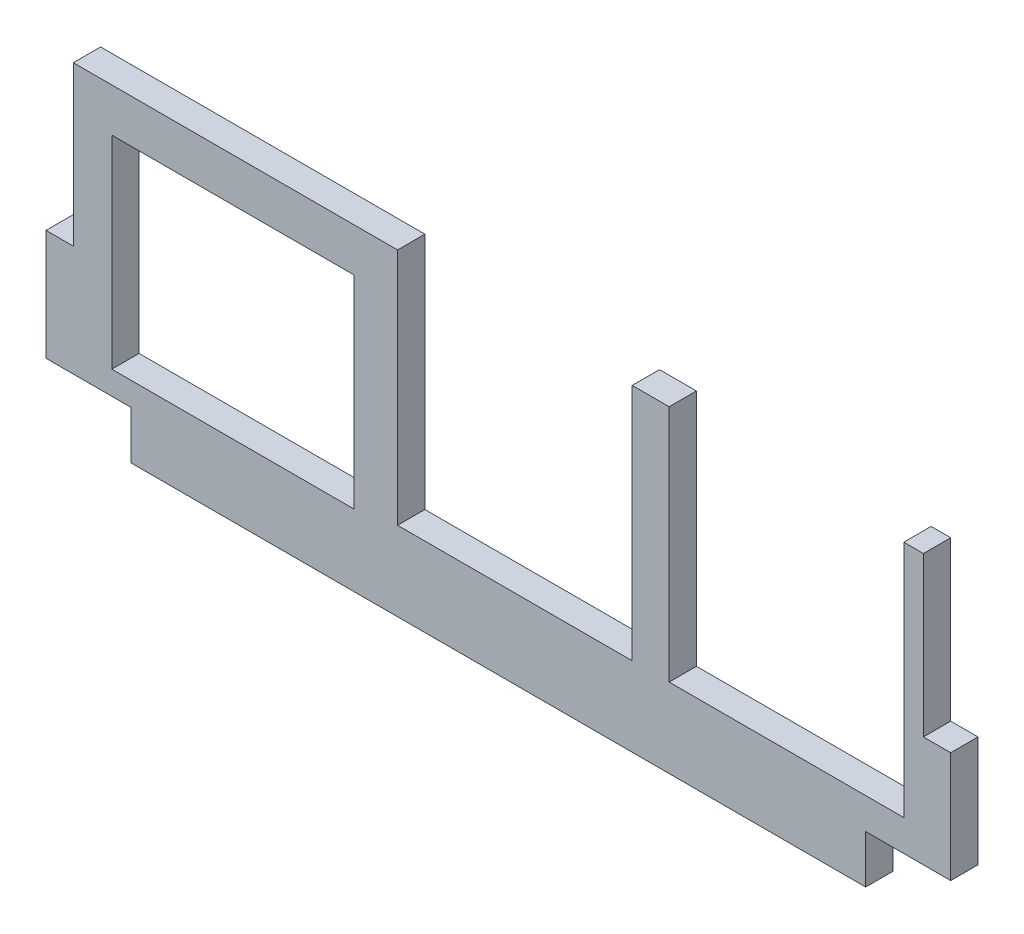
ISO-10303-21;
HEADER;
FILE_DESCRIPTION(('STEP AP214'),'2;1');
FILE_NAME('part.step','',(''),(''),'','','');
FILE_SCHEMA(('AUTOMOTIVE_DESIGN { 1 0 10303 214 1 1 1 1 }'));
ENDSEC;
DATA;
#1=APPLICATION_CONTEXT('core data for automotive mechanical design processes');
#2=APPLICATION_PROTOCOL_DEFINITION('international standard','automotive_design',2000,#1);
#3=PRODUCT_CONTEXT('',#1,'mechanical');
#4=PRODUCT('Part','Part','',(#3));
#5=PRODUCT_RELATED_PRODUCT_CATEGORY('part','',(#4));
#6=PRODUCT_DEFINITION_FORMATION('','',#4);
#7=PRODUCT_DEFINITION_CONTEXT('part definition',#1,'design');
#8=PRODUCT_DEFINITION('design','',#6,#7);
#9=PRODUCT_DEFINITION_SHAPE('','',#8);
#10=(LENGTH_UNIT() NAMED_UNIT(*) SI_UNIT(.MILLI.,.METRE.));
#11=(NAMED_UNIT(*) PLANE_ANGLE_UNIT() SI_UNIT($,.RADIAN.));
#12=(NAMED_UNIT(*) SI_UNIT($,.STERADIAN.) SOLID_ANGLE_UNIT());
#13=UNCERTAINTY_MEASURE_WITH_UNIT(LENGTH_MEASURE(1.E-05),#10,'distance_accuracy_value','');
#14=(GEOMETRIC_REPRESENTATION_CONTEXT(3) GLOBAL_UNCERTAINTY_ASSIGNED_CONTEXT((#13)) GLOBAL_UNIT_ASSIGNED_CONTEXT((#10,
#11,#12)) REPRESENTATION_CONTEXT('',''));
#15=CARTESIAN_POINT('',(0.,0.,0.));
#16=DIRECTION('',(0.,0.,1.));
#17=DIRECTION('',(1.,0.,0.));
#18=AXIS2_PLACEMENT_3D('',#15,#16,#17);
#19=CARTESIAN_POINT('',(-1.8034,12.0396,1.8034));
#20=DIRECTION('',(1.,0.,0.));
#21=DIRECTION('',(0.,0.,-1.));
#22=AXIS2_PLACEMENT_3D('',#19,#20,#21);
#23=PLANE('',#22);
#24=DIRECTION('',(0.,-1.,0.));
#25=VECTOR('',#24,1.);
#26=CARTESIAN_POINT('',(-1.8034,12.0396,0.));
#27=LINE('',#26,#25);
#28=CARTESIAN_POINT('',(-1.8034,12.0396,0.));
#29=VERTEX_POINT('',#28);
#30=CARTESIAN_POINT('',(-1.8034,4.72440000000001,0.));
#31=VERTEX_POINT('',#30);
#32=EDGE_CURVE('E230',#29,#31,#27,.T.);
#33=ORIENTED_EDGE('',*,*,#32,.T.);
#34=DIRECTION('',(0.,0.,-1.));
#35=VECTOR('',#34,1.);
#36=CARTESIAN_POINT('',(-1.8034,4.72440000000001,1.8034));
#37=LINE('',#36,#35);
#38=CARTESIAN_POINT('',(-1.8034,4.72440000000001,1.8034));
#39=VERTEX_POINT('',#38);
#40=EDGE_CURVE('E11',#39,#31,#37,.T.);
#41=ORIENTED_EDGE('',*,*,#40,.F.);
#42=DIRECTION('',(0.,-1.,0.));
#43=VECTOR('',#42,1.);
#44=CARTESIAN_POINT('',(-1.8034,12.0396,1.8034));
#45=LINE('',#44,#43);
#46=CARTESIAN_POINT('',(-1.8034,12.0396,1.8034));
#47=VERTEX_POINT('',#46);
#48=EDGE_CURVE('E232',#47,#39,#45,.T.);
#49=ORIENTED_EDGE('',*,*,#48,.F.);
#50=DIRECTION('',(0.,0.,-1.));
#51=VECTOR('',#50,1.);
#52=CARTESIAN_POINT('',(-1.8034,12.0396,1.8034));
#53=LINE('',#52,#51);
#54=EDGE_CURVE('E272',#47,#29,#53,.T.);
#55=ORIENTED_EDGE('',*,*,#54,.T.);
#56=EDGE_LOOP('',(#33,#41,#49,#55));
#57=FACE_BOUND('',#56,.T.);
#58=ADVANCED_FACE('F33',(#57),#23,.F.);
#59=CARTESIAN_POINT('',(-1.8034,4.72440000000001,1.8034));
#60=DIRECTION('',(0.,1.,0.));
#61=DIRECTION('',(0.,0.,1.));
#62=AXIS2_PLACEMENT_3D('',#59,#60,#61);
#63=PLANE('',#62);
#64=DIRECTION('',(1.,0.,0.));
#65=VECTOR('',#64,1.);
#66=CARTESIAN_POINT('',(-1.8034,4.72440000000001,0.));
#67=LINE('',#66,#65);
#68=CARTESIAN_POINT('',(3.81,4.72440000000001,0.));
#69=VERTEX_POINT('',#68);
#70=EDGE_CURVE('E275',#31,#69,#67,.T.);
#71=ORIENTED_EDGE('',*,*,#70,.T.);
#72=DIRECTION('',(0.,0.,-1.));
#73=VECTOR('',#72,1.);
#74=CARTESIAN_POINT('',(3.81,4.72440000000001,1.8034));
#75=LINE('',#74,#73);
#76=CARTESIAN_POINT('',(3.81,4.72440000000001,1.8034));
#77=VERTEX_POINT('',#76);
#78=EDGE_CURVE('E40',#77,#69,#75,.T.);
#79=ORIENTED_EDGE('',*,*,#78,.F.);
#80=DIRECTION('',(1.,0.,0.));
#81=VECTOR('',#80,1.);
#82=CARTESIAN_POINT('',(-1.8034,4.72440000000001,1.8034));
#83=LINE('',#82,#81);
#84=EDGE_CURVE('E139',#39,#77,#83,.T.);
#85=ORIENTED_EDGE('',*,*,#84,.F.);
#86=ORIENTED_EDGE('',*,*,#40,.T.);
#87=EDGE_LOOP('',(#71,#79,#85,#86));
#88=FACE_BOUND('',#87,.T.);
#89=ADVANCED_FACE('F393',(#88),#63,.F.);
#90=CARTESIAN_POINT('',(3.81,1.54940000000001,1.8034));
#91=DIRECTION('',(1.,0.,0.));
#92=DIRECTION('',(0.,0.,-1.));
#93=AXIS2_PLACEMENT_3D('',#90,#91,#92);
#94=PLANE('',#93);
#95=DIRECTION('',(0.,-1.,0.));
#96=VECTOR('',#95,1.);
#97=CARTESIAN_POINT('',(3.81,1.54940000000001,0.));
#98=LINE('',#97,#96);
#99=CARTESIAN_POINT('',(3.81,1.54940000000001,0.));
#100=VERTEX_POINT('',#99);
#101=EDGE_CURVE('E277',#69,#100,#98,.T.);
#102=ORIENTED_EDGE('',*,*,#101,.T.);
#103=DIRECTION('',(0.,0.,-1.));
#104=VECTOR('',#103,1.);
#105=CARTESIAN_POINT('',(3.81,1.54940000000001,1.8034));
#106=LINE('',#105,#104);
#107=CARTESIAN_POINT('',(3.81,1.54940000000001,1.8034));
#108=VERTEX_POINT('',#107);
#109=EDGE_CURVE('E366',#108,#100,#106,.T.);
#110=ORIENTED_EDGE('',*,*,#109,.F.);
#111=DIRECTION('',(0.,-1.,0.));
#112=VECTOR('',#111,1.);
#113=CARTESIAN_POINT('',(3.81,1.54940000000001,1.8034));
#114=LINE('',#113,#112);
#115=EDGE_CURVE('E235',#77,#108,#114,.T.);
#116=ORIENTED_EDGE('',*,*,#115,.F.);
#117=ORIENTED_EDGE('',*,*,#78,.T.);
#118=EDGE_LOOP('',(#102,#110,#116,#117));
#119=FACE_BOUND('',#118,.T.);
#120=ADVANCED_FACE('F372',(#119),#94,.F.);
#121=CARTESIAN_POINT('',(3.81,1.54940000000001,1.8034));
#122=DIRECTION('',(0.,1.,0.));
#123=DIRECTION('',(0.,0.,1.));
#124=AXIS2_PLACEMENT_3D('',#121,#122,#123);
#125=PLANE('',#124);
#126=DIRECTION('',(1.,0.,0.));
#127=VECTOR('',#126,1.);
#128=CARTESIAN_POINT('',(3.81,1.54940000000001,0.));
#129=LINE('',#128,#127);
#130=CARTESIAN_POINT('',(52.324,1.54940000000001,0.));
#131=VERTEX_POINT('',#130);
#132=EDGE_CURVE('E279',#100,#131,#129,.T.);
#133=ORIENTED_EDGE('',*,*,#132,.T.);
#134=DIRECTION('',(0.,0.,-1.));
#135=VECTOR('',#134,1.);
#136=CARTESIAN_POINT('',(52.324,1.54940000000001,1.8034));
#137=LINE('',#136,#135);
#138=CARTESIAN_POINT('',(52.324,1.54940000000001,1.8034));
#139=VERTEX_POINT('',#138);
#140=EDGE_CURVE('E363',#139,#131,#137,.T.);
#141=ORIENTED_EDGE('',*,*,#140,.F.);
#142=DIRECTION('',(1.,0.,0.));
#143=VECTOR('',#142,1.);
#144=CARTESIAN_POINT('',(3.81,1.54940000000001,1.8034));
#145=LINE('',#144,#143);
#146=EDGE_CURVE('E237',#108,#139,#145,.T.);
#147=ORIENTED_EDGE('',*,*,#146,.F.);
#148=ORIENTED_EDGE('',*,*,#109,.T.);
#149=EDGE_LOOP('',(#133,#141,#147,#148));
#150=FACE_BOUND('',#149,.T.);
#151=ADVANCED_FACE('F382',(#150),#125,.F.);
#152=CARTESIAN_POINT('',(52.324,1.54940000000001,1.8034));
#153=DIRECTION('',(-1.,0.,0.));
#154=DIRECTION('',(0.,0.,1.));
#155=AXIS2_PLACEMENT_3D('',#152,#153,#154);
#156=PLANE('',#155);
#157=DIRECTION('',(0.,1.,0.));
#158=VECTOR('',#157,1.);
#159=CARTESIAN_POINT('',(52.324,1.54940000000001,0.));
#160=LINE('',#159,#158);
#161=CARTESIAN_POINT('',(52.324,4.72440000000001,0.));
#162=VERTEX_POINT('',#161);
#163=EDGE_CURVE('E281',#131,#162,#160,.T.);
#164=ORIENTED_EDGE('',*,*,#163,.T.);
#165=DIRECTION('',(0.,0.,-1.));
#166=VECTOR('',#165,1.);
#167=CARTESIAN_POINT('',(52.324,4.72440000000001,1.8034));
#168=LINE('',#167,#166);
#169=CARTESIAN_POINT('',(52.324,4.72440000000001,1.8034));
#170=VERTEX_POINT('',#169);
#171=EDGE_CURVE('E360',#170,#162,#168,.T.);
#172=ORIENTED_EDGE('',*,*,#171,.F.);
#173=DIRECTION('',(0.,1.,0.));
#174=VECTOR('',#173,1.);
#175=CARTESIAN_POINT('',(52.324,1.54940000000001,1.8034));
#176=LINE('',#175,#174);
#177=EDGE_CURVE('E239',#139,#170,#176,.T.);
#178=ORIENTED_EDGE('',*,*,#177,.F.);
#179=ORIENTED_EDGE('',*,*,#140,.T.);
#180=EDGE_LOOP('',(#164,#172,#178,#179));
#181=FACE_BOUND('',#180,.T.);
#182=ADVANCED_FACE('F386',(#181),#156,.F.);
#183=CARTESIAN_POINT('',(52.324,4.72440000000001,1.8034));
#184=DIRECTION('',(0.,1.,0.));
#185=DIRECTION('',(0.,0.,1.));
#186=AXIS2_PLACEMENT_3D('',#183,#184,#185);
#187=PLANE('',#186);
#188=DIRECTION('',(1.,0.,0.));
#189=VECTOR('',#188,1.);
#190=CARTESIAN_POINT('',(52.324,4.72440000000001,0.));
#191=LINE('',#190,#189);
#192=CARTESIAN_POINT('',(57.9374,4.72440000000001,0.));
#193=VERTEX_POINT('',#192);
#194=EDGE_CURVE('E283',#162,#193,#191,.T.);
#195=ORIENTED_EDGE('',*,*,#194,.T.);
#196=DIRECTION('',(0.,0.,-1.));
#197=VECTOR('',#196,1.);
#198=CARTESIAN_POINT('',(57.9374,4.72440000000001,1.8034));
#199=LINE('',#198,#197);
#200=CARTESIAN_POINT('',(57.9374,4.72440000000001,1.8034));
#201=VERTEX_POINT('',#200);
#202=EDGE_CURVE('E357',#201,#193,#199,.T.);
#203=ORIENTED_EDGE('',*,*,#202,.F.);
#204=DIRECTION('',(1.,0.,0.));
#205=VECTOR('',#204,1.);
#206=CARTESIAN_POINT('',(52.324,4.72440000000001,1.8034));
#207=LINE('',#206,#205);
#208=EDGE_CURVE('E241',#170,#201,#207,.T.);
#209=ORIENTED_EDGE('',*,*,#208,.F.);
#210=ORIENTED_EDGE('',*,*,#171,.T.);
#211=EDGE_LOOP('',(#195,#203,#209,#210));
#212=FACE_BOUND('',#211,.T.);
#213=ADVANCED_FACE('F405',(#212),#187,.F.);
#214=CARTESIAN_POINT('',(57.9374,4.72440000000001,1.8034));
#215=DIRECTION('',(-1.,0.,0.));
#216=DIRECTION('',(0.,0.,1.));
#217=AXIS2_PLACEMENT_3D('',#214,#215,#216);
#218=PLANE('',#217);
#219=DIRECTION('',(0.,1.,0.));
#220=VECTOR('',#219,1.);
#221=CARTESIAN_POINT('',(57.9374,4.72440000000001,0.));
#222=LINE('',#221,#220);
#223=CARTESIAN_POINT('',(57.9374,12.0396,0.));
#224=VERTEX_POINT('',#223);
#225=EDGE_CURVE('E285',#193,#224,#222,.T.);
#226=ORIENTED_EDGE('',*,*,#225,.T.);
#227=DIRECTION('',(0.,0.,-1.));
#228=VECTOR('',#227,1.);
#229=CARTESIAN_POINT('',(57.9374,12.0396,1.8034));
#230=LINE('',#229,#228);
#231=CARTESIAN_POINT('',(57.9374,12.0396,1.8034));
#232=VERTEX_POINT('',#231);
#233=EDGE_CURVE('E354',#232,#224,#230,.T.);
#234=ORIENTED_EDGE('',*,*,#233,.F.);
#235=DIRECTION('',(0.,1.,0.));
#236=VECTOR('',#235,1.);
#237=CARTESIAN_POINT('',(57.9374,4.72440000000001,1.8034));
#238=LINE('',#237,#236);
#239=EDGE_CURVE('E243',#201,#232,#238,.T.);
#240=ORIENTED_EDGE('',*,*,#239,.F.);
#241=ORIENTED_EDGE('',*,*,#202,.T.);
#242=EDGE_LOOP('',(#226,#234,#240,#241));
#243=FACE_BOUND('',#242,.T.);
#244=ADVANCED_FACE('F408',(#243),#218,.F.);
#245=CARTESIAN_POINT('',(57.9374,12.0396,1.8034));
#246=DIRECTION('',(0.,-1.,0.));
#247=DIRECTION('',(0.,0.,-1.));
#248=AXIS2_PLACEMENT_3D('',#245,#246,#247);
#249=PLANE('',#248);
#250=DIRECTION('',(-1.,0.,0.));
#251=VECTOR('',#250,1.);
#252=CARTESIAN_POINT('',(57.9374,12.0396,0.));
#253=LINE('',#252,#251);
#254=CARTESIAN_POINT('',(56.134,12.0396,0.));
#255=VERTEX_POINT('',#254);
#256=EDGE_CURVE('E287',#224,#255,#253,.T.);
#257=ORIENTED_EDGE('',*,*,#256,.T.);
#258=DIRECTION('',(0.,0.,-1.));
#259=VECTOR('',#258,1.);
#260=CARTESIAN_POINT('',(56.134,12.0396,1.8034));
#261=LINE('',#260,#259);
#262=CARTESIAN_POINT('',(56.134,12.0396,1.8034));
#263=VERTEX_POINT('',#262);
#264=EDGE_CURVE('E351',#263,#255,#261,.T.);
#265=ORIENTED_EDGE('',*,*,#264,.F.);
#266=DIRECTION('',(-1.,0.,0.));
#267=VECTOR('',#266,1.);
#268=CARTESIAN_POINT('',(57.9374,12.0396,1.8034));
#269=LINE('',#268,#267);
#270=EDGE_CURVE('E245',#232,#263,#269,.T.);
#271=ORIENTED_EDGE('',*,*,#270,.F.);
#272=ORIENTED_EDGE('',*,*,#233,.T.);
#273=EDGE_LOOP('',(#257,#265,#271,#272));
#274=FACE_BOUND('',#273,.T.);
#275=ADVANCED_FACE('F412',(#274),#249,.F.);
#276=CARTESIAN_POINT('',(56.134,22.5298,1.8034));
#277=DIRECTION('',(-1.,0.,0.));
#278=DIRECTION('',(0.,0.,1.));
#279=AXIS2_PLACEMENT_3D('',#276,#277,#278);
#280=PLANE('',#279);
#281=DIRECTION('',(0.,1.,0.));
#282=VECTOR('',#281,1.);
#283=CARTESIAN_POINT('',(56.134,22.5298,0.));
#284=LINE('',#283,#282);
#285=CARTESIAN_POINT('',(56.134,22.5298,0.));
#286=VERTEX_POINT('',#285);
#287=EDGE_CURVE('E289',#255,#286,#284,.T.);
#288=ORIENTED_EDGE('',*,*,#287,.T.);
#289=DIRECTION('',(0.,0.,-1.));
#290=VECTOR('',#289,1.);
#291=CARTESIAN_POINT('',(56.134,22.5298,1.8034));
#292=LINE('',#291,#290);
#293=CARTESIAN_POINT('',(56.134,22.5298,1.8034));
#294=VERTEX_POINT('',#293);
#295=EDGE_CURVE('E348',#294,#286,#292,.T.);
#296=ORIENTED_EDGE('',*,*,#295,.F.);
#297=DIRECTION('',(0.,1.,0.));
#298=VECTOR('',#297,1.);
#299=CARTESIAN_POINT('',(56.134,22.5298,1.8034));
#300=LINE('',#299,#298);
#301=EDGE_CURVE('E247',#263,#294,#300,.T.);
#302=ORIENTED_EDGE('',*,*,#301,.F.);
#303=ORIENTED_EDGE('',*,*,#264,.T.);
#304=EDGE_LOOP('',(#288,#296,#302,#303));
#305=FACE_BOUND('',#304,.T.);
#306=ADVANCED_FACE('F416',(#305),#280,.F.);
#307=CARTESIAN_POINT('',(54.8386,22.5298,1.8034));
#308=DIRECTION('',(0.,-1.,0.));
#309=DIRECTION('',(0.,0.,-1.));
#310=AXIS2_PLACEMENT_3D('',#307,#308,#309);
#311=PLANE('',#310);
#312=DIRECTION('',(-1.,0.,0.));
#313=VECTOR('',#312,1.);
#314=CARTESIAN_POINT('',(54.8386,22.5298,0.));
#315=LINE('',#314,#313);
#316=CARTESIAN_POINT('',(54.8386,22.5298,0.));
#317=VERTEX_POINT('',#316);
#318=EDGE_CURVE('E291',#286,#317,#315,.T.);
#319=ORIENTED_EDGE('',*,*,#318,.T.);
#320=DIRECTION('',(0.,0.,-1.));
#321=VECTOR('',#320,1.);
#322=CARTESIAN_POINT('',(54.8386,22.5298,1.8034));
#323=LINE('',#322,#321);
#324=CARTESIAN_POINT('',(54.8386,22.5298,1.8034));
#325=VERTEX_POINT('',#324);
#326=EDGE_CURVE('E345',#325,#317,#323,.T.);
#327=ORIENTED_EDGE('',*,*,#326,.F.);
#328=DIRECTION('',(-1.,0.,0.));
#329=VECTOR('',#328,1.);
#330=CARTESIAN_POINT('',(54.8386,22.5298,1.8034));
#331=LINE('',#330,#329);
#332=EDGE_CURVE('E249',#294,#325,#331,.T.);
#333=ORIENTED_EDGE('',*,*,#332,.F.);
#334=ORIENTED_EDGE('',*,*,#295,.T.);
#335=EDGE_LOOP('',(#319,#327,#333,#334));
#336=FACE_BOUND('',#335,.T.);
#337=ADVANCED_FACE('F420',(#336),#311,.F.);
#338=CARTESIAN_POINT('',(54.8386,6.78180000000001,1.8034));
#339=DIRECTION('',(1.,0.,0.));
#340=DIRECTION('',(0.,0.,-1.));
#341=AXIS2_PLACEMENT_3D('',#338,#339,#340);
#342=PLANE('',#341);
#343=DIRECTION('',(0.,-1.,0.));
#344=VECTOR('',#343,1.);
#345=CARTESIAN_POINT('',(54.8386,6.78180000000001,0.));
#346=LINE('',#345,#344);
#347=CARTESIAN_POINT('',(54.8386,6.78180000000001,0.));
#348=VERTEX_POINT('',#347);
#349=EDGE_CURVE('E293',#317,#348,#346,.T.);
#350=ORIENTED_EDGE('',*,*,#349,.T.);
#351=DIRECTION('',(0.,0.,-1.));
#352=VECTOR('',#351,1.);
#353=CARTESIAN_POINT('',(54.8386,6.78180000000001,1.8034));
#354=LINE('',#353,#352);
#355=CARTESIAN_POINT('',(54.8386,6.78180000000001,1.8034));
#356=VERTEX_POINT('',#355);
#357=EDGE_CURVE('E342',#356,#348,#354,.T.);
#358=ORIENTED_EDGE('',*,*,#357,.F.);
#359=DIRECTION('',(0.,-1.,0.));
#360=VECTOR('',#359,1.);
#361=CARTESIAN_POINT('',(54.8386,6.78180000000001,1.8034));
#362=LINE('',#361,#360);
#363=EDGE_CURVE('E251',#325,#356,#362,.T.);
#364=ORIENTED_EDGE('',*,*,#363,.F.);
#365=ORIENTED_EDGE('',*,*,#326,.T.);
#366=EDGE_LOOP('',(#350,#358,#364,#365));
#367=FACE_BOUND('',#366,.T.);
#368=ADVANCED_FACE('F424',(#367),#342,.F.);
#369=CARTESIAN_POINT('',(39.3446,6.78180000000001,1.8034));
#370=DIRECTION('',(0.,-1.,0.));
#371=DIRECTION('',(0.,0.,-1.));
#372=AXIS2_PLACEMENT_3D('',#369,#370,#371);
#373=PLANE('',#372);
#374=DIRECTION('',(-1.,0.,0.));
#375=VECTOR('',#374,1.);
#376=CARTESIAN_POINT('',(39.3446,6.78180000000001,0.));
#377=LINE('',#376,#375);
#378=CARTESIAN_POINT('',(39.3446,6.78180000000001,0.));
#379=VERTEX_POINT('',#378);
#380=EDGE_CURVE('E295',#348,#379,#377,.T.);
#381=ORIENTED_EDGE('',*,*,#380,.T.);
#382=DIRECTION('',(0.,0.,-1.));
#383=VECTOR('',#382,1.);
#384=CARTESIAN_POINT('',(39.3446,6.78180000000001,1.8034));
#385=LINE('',#384,#383);
#386=CARTESIAN_POINT('',(39.3446,6.78180000000001,1.8034));
#387=VERTEX_POINT('',#386);
#388=EDGE_CURVE('E339',#387,#379,#385,.T.);
#389=ORIENTED_EDGE('',*,*,#388,.F.);
#390=DIRECTION('',(-1.,0.,0.));
#391=VECTOR('',#390,1.);
#392=CARTESIAN_POINT('',(39.3446,6.78180000000001,1.8034));
#393=LINE('',#392,#391);
#394=EDGE_CURVE('E253',#356,#387,#393,.T.);
#395=ORIENTED_EDGE('',*,*,#394,.F.);
#396=ORIENTED_EDGE('',*,*,#357,.T.);
#397=EDGE_LOOP('',(#381,#389,#395,#396));
#398=FACE_BOUND('',#397,.T.);
#399=ADVANCED_FACE('F428',(#398),#373,.F.);
#400=CARTESIAN_POINT('',(39.3446,22.5298,1.8034));
#401=DIRECTION('',(-1.,0.,0.));
#402=DIRECTION('',(0.,0.,1.));
#403=AXIS2_PLACEMENT_3D('',#400,#401,#402);
#404=PLANE('',#403);
#405=DIRECTION('',(0.,1.,0.));
#406=VECTOR('',#405,1.);
#407=CARTESIAN_POINT('',(39.3446,22.5298,0.));
#408=LINE('',#407,#406);
#409=CARTESIAN_POINT('',(39.3446,22.5298,0.));
#410=VERTEX_POINT('',#409);
#411=EDGE_CURVE('E297',#379,#410,#408,.T.);
#412=ORIENTED_EDGE('',*,*,#411,.T.);
#413=DIRECTION('',(0.,0.,-1.));
#414=VECTOR('',#413,1.);
#415=CARTESIAN_POINT('',(39.3446,22.5298,1.8034));
#416=LINE('',#415,#414);
#417=CARTESIAN_POINT('',(39.3446,22.5298,1.8034));
#418=VERTEX_POINT('',#417);
#419=EDGE_CURVE('E336',#418,#410,#416,.T.);
#420=ORIENTED_EDGE('',*,*,#419,.F.);
#421=DIRECTION('',(0.,1.,0.));
#422=VECTOR('',#421,1.);
#423=CARTESIAN_POINT('',(39.3446,22.5298,1.8034));
#424=LINE('',#423,#422);
#425=EDGE_CURVE('E255',#387,#418,#424,.T.);
#426=ORIENTED_EDGE('',*,*,#425,.F.);
#427=ORIENTED_EDGE('',*,*,#388,.T.);
#428=EDGE_LOOP('',(#412,#420,#426,#427));
#429=FACE_BOUND('',#428,.T.);
#430=ADVANCED_FACE('F432',(#429),#404,.F.);
#431=CARTESIAN_POINT('',(36.9062,22.5298,1.8034));
#432=DIRECTION('',(0.,-1.,0.));
#433=DIRECTION('',(0.,0.,-1.));
#434=AXIS2_PLACEMENT_3D('',#431,#432,#433);
#435=PLANE('',#434);
#436=DIRECTION('',(-1.,0.,0.));
#437=VECTOR('',#436,1.);
#438=CARTESIAN_POINT('',(36.9062,22.5298,0.));
#439=LINE('',#438,#437);
#440=CARTESIAN_POINT('',(36.9062,22.5298,0.));
#441=VERTEX_POINT('',#440);
#442=EDGE_CURVE('E299',#410,#441,#439,.T.);
#443=ORIENTED_EDGE('',*,*,#442,.T.);
#444=DIRECTION('',(0.,0.,-1.));
#445=VECTOR('',#444,1.);
#446=CARTESIAN_POINT('',(36.9062,22.5298,1.8034));
#447=LINE('',#446,#445);
#448=CARTESIAN_POINT('',(36.9062,22.5298,1.8034));
#449=VERTEX_POINT('',#448);
#450=EDGE_CURVE('E333',#449,#441,#447,.T.);
#451=ORIENTED_EDGE('',*,*,#450,.F.);
#452=DIRECTION('',(-1.,0.,0.));
#453=VECTOR('',#452,1.);
#454=CARTESIAN_POINT('',(36.9062,22.5298,1.8034));
#455=LINE('',#454,#453);
#456=EDGE_CURVE('E257',#418,#449,#455,.T.);
#457=ORIENTED_EDGE('',*,*,#456,.F.);
#458=ORIENTED_EDGE('',*,*,#419,.T.);
#459=EDGE_LOOP('',(#443,#451,#457,#458));
#460=FACE_BOUND('',#459,.T.);
#461=ADVANCED_FACE('F436',(#460),#435,.F.);
#462=CARTESIAN_POINT('',(36.9062,6.78180000000001,1.8034));
#463=DIRECTION('',(1.,0.,0.));
#464=DIRECTION('',(0.,0.,-1.));
#465=AXIS2_PLACEMENT_3D('',#462,#463,#464);
#466=PLANE('',#465);
#467=DIRECTION('',(0.,-1.,0.));
#468=VECTOR('',#467,1.);
#469=CARTESIAN_POINT('',(36.9062,6.78180000000001,0.));
#470=LINE('',#469,#468);
#471=CARTESIAN_POINT('',(36.9062,6.78180000000001,0.));
#472=VERTEX_POINT('',#471);
#473=EDGE_CURVE('E301',#441,#472,#470,.T.);
#474=ORIENTED_EDGE('',*,*,#473,.T.);
#475=DIRECTION('',(0.,0.,-1.));
#476=VECTOR('',#475,1.);
#477=CARTESIAN_POINT('',(36.9062,6.78180000000001,1.8034));
#478=LINE('',#477,#476);
#479=CARTESIAN_POINT('',(36.9062,6.78180000000001,1.8034));
#480=VERTEX_POINT('',#479);
#481=EDGE_CURVE('E330',#480,#472,#478,.T.);
#482=ORIENTED_EDGE('',*,*,#481,.F.);
#483=DIRECTION('',(0.,-1.,0.));
#484=VECTOR('',#483,1.);
#485=CARTESIAN_POINT('',(36.9062,6.78180000000001,1.8034));
#486=LINE('',#485,#484);
#487=EDGE_CURVE('E259',#449,#480,#486,.T.);
#488=ORIENTED_EDGE('',*,*,#487,.F.);
#489=ORIENTED_EDGE('',*,*,#450,.T.);
#490=EDGE_LOOP('',(#474,#482,#488,#489));
#491=FACE_BOUND('',#490,.T.);
#492=ADVANCED_FACE('F440',(#491),#466,.F.);
#493=CARTESIAN_POINT('',(21.4122,6.78180000000001,1.8034));
#494=DIRECTION('',(0.,-1.,0.));
#495=DIRECTION('',(0.,0.,-1.));
#496=AXIS2_PLACEMENT_3D('',#493,#494,#495);
#497=PLANE('',#496);
#498=DIRECTION('',(-1.,0.,0.));
#499=VECTOR('',#498,1.);
#500=CARTESIAN_POINT('',(21.4122,6.78180000000001,0.));
#501=LINE('',#500,#499);
#502=CARTESIAN_POINT('',(21.4122,6.78180000000001,0.));
#503=VERTEX_POINT('',#502);
#504=EDGE_CURVE('E303',#472,#503,#501,.T.);
#505=ORIENTED_EDGE('',*,*,#504,.T.);
#506=DIRECTION('',(0.,0.,-1.));
#507=VECTOR('',#506,1.);
#508=CARTESIAN_POINT('',(21.4122,6.78180000000001,1.8034));
#509=LINE('',#508,#507);
#510=CARTESIAN_POINT('',(21.4122,6.78180000000001,1.8034));
#511=VERTEX_POINT('',#510);
#512=EDGE_CURVE('E327',#511,#503,#509,.T.);
#513=ORIENTED_EDGE('',*,*,#512,.F.);
#514=DIRECTION('',(-1.,0.,0.));
#515=VECTOR('',#514,1.);
#516=CARTESIAN_POINT('',(21.4122,6.78180000000001,1.8034));
#517=LINE('',#516,#515);
#518=EDGE_CURVE('E261',#480,#511,#517,.T.);
#519=ORIENTED_EDGE('',*,*,#518,.F.);
#520=ORIENTED_EDGE('',*,*,#481,.T.);
#521=EDGE_LOOP('',(#505,#513,#519,#520));
#522=FACE_BOUND('',#521,.T.);
#523=ADVANCED_FACE('F444',(#522),#497,.F.);
#524=CARTESIAN_POINT('',(21.4122,22.5298,1.8034));
#525=DIRECTION('',(-1.,0.,0.));
#526=DIRECTION('',(0.,-1.,0.));
#527=AXIS2_PLACEMENT_3D('',#524,#525,#526);
#528=PLANE('',#527);
#529=DIRECTION('',(0.,1.,0.));
#530=VECTOR('',#529,1.);
#531=CARTESIAN_POINT('',(21.4122,22.5298,0.));
#532=LINE('',#531,#530);
#533=CARTESIAN_POINT('',(21.4122,22.5298,0.));
#534=VERTEX_POINT('',#533);
#535=EDGE_CURVE('E305',#503,#534,#532,.T.);
#536=ORIENTED_EDGE('',*,*,#535,.T.);
#537=DIRECTION('',(0.,0.,-1.));
#538=VECTOR('',#537,1.);
#539=CARTESIAN_POINT('',(21.4122,22.5298,1.8034));
#540=LINE('',#539,#538);
#541=CARTESIAN_POINT('',(21.4122,22.5298,1.8034));
#542=VERTEX_POINT('',#541);
#543=EDGE_CURVE('E324',#542,#534,#540,.T.);
#544=ORIENTED_EDGE('',*,*,#543,.F.);
#545=DIRECTION('',(0.,1.,0.));
#546=VECTOR('',#545,1.);
#547=CARTESIAN_POINT('',(21.4122,22.5298,1.8034));
#548=LINE('',#547,#546);
#549=EDGE_CURVE('E263',#511,#542,#548,.T.);
#550=ORIENTED_EDGE('',*,*,#549,.F.);
#551=ORIENTED_EDGE('',*,*,#512,.T.);
#552=EDGE_LOOP('',(#536,#544,#550,#551));
#553=FACE_BOUND('',#552,.T.);
#554=ADVANCED_FACE('F448',(#553),#528,.F.);
#555=CARTESIAN_POINT('',(18.542,22.5298,1.8034));
#556=DIRECTION('',(0.,-1.,0.));
#557=DIRECTION('',(0.,0.,-1.));
#558=AXIS2_PLACEMENT_3D('',#555,#556,#557);
#559=PLANE('',#558);
#560=DIRECTION('',(-1.,0.,0.));
#561=VECTOR('',#560,1.);
#562=CARTESIAN_POINT('',(18.542,22.5298,0.));
#563=LINE('',#562,#561);
#564=CARTESIAN_POINT('',(0.,22.5298,0.));
#565=VERTEX_POINT('',#564);
#566=EDGE_CURVE('E307',#534,#565,#563,.T.);
#567=ORIENTED_EDGE('',*,*,#566,.T.);
#568=DIRECTION('',(0.,0.,1.));
#569=VECTOR('',#568,1.);
#570=CARTESIAN_POINT('',(0.,22.5298,0.));
#571=LINE('',#570,#569);
#572=CARTESIAN_POINT('',(0.,22.5298,1.8034));
#573=VERTEX_POINT('',#572);
#574=EDGE_CURVE('E227',#565,#573,#571,.T.);
#575=ORIENTED_EDGE('',*,*,#574,.T.);
#576=DIRECTION('',(-1.,0.,0.));
#577=VECTOR('',#576,1.);
#578=CARTESIAN_POINT('',(18.542,22.5298,1.8034));
#579=LINE('',#578,#577);
#580=EDGE_CURVE('E265',#542,#573,#579,.T.);
#581=ORIENTED_EDGE('',*,*,#580,.F.);
#582=ORIENTED_EDGE('',*,*,#543,.T.);
#583=EDGE_LOOP('',(#567,#575,#581,#582));
#584=FACE_BOUND('',#583,.T.);
#585=ADVANCED_FACE('F452',(#584),#559,.F.);
#586=CARTESIAN_POINT('',(18.542,6.27380000000001,1.8034));
#587=DIRECTION('',(1.,0.,0.));
#588=DIRECTION('',(0.,0.,-1.));
#589=AXIS2_PLACEMENT_3D('',#586,#587,#588);
#590=PLANE('',#589);
#591=DIRECTION('',(0.,-1.,0.));
#592=VECTOR('',#591,1.);
#593=CARTESIAN_POINT('',(18.542,6.27380000000001,1.8034));
#594=LINE('',#593,#592);
#595=CARTESIAN_POINT('',(18.542,19.6596,1.8034));
#596=VERTEX_POINT('',#595);
#597=CARTESIAN_POINT('',(18.542,6.27380000000001,1.8034));
#598=VERTEX_POINT('',#597);
#599=EDGE_CURVE('E47',#596,#598,#594,.T.);
#600=ORIENTED_EDGE('',*,*,#599,.F.);
#601=DIRECTION('',(0.,0.,1.));
#602=VECTOR('',#601,1.);
#603=CARTESIAN_POINT('',(18.542,19.6596,0.));
#604=LINE('',#603,#602);
#605=CARTESIAN_POINT('',(18.542,19.6596,0.));
#606=VERTEX_POINT('',#605);
#607=EDGE_CURVE('E222',#606,#596,#604,.T.);
#608=ORIENTED_EDGE('',*,*,#607,.F.);
#609=DIRECTION('',(0.,-1.,0.));
#610=VECTOR('',#609,1.);
#611=CARTESIAN_POINT('',(18.542,6.27380000000001,0.));
#612=LINE('',#611,#610);
#613=CARTESIAN_POINT('',(18.542,6.27380000000001,0.));
#614=VERTEX_POINT('',#613);
#615=EDGE_CURVE('E310',#606,#614,#612,.T.);
#616=ORIENTED_EDGE('',*,*,#615,.T.);
#617=DIRECTION('',(0.,0.,-1.));
#618=VECTOR('',#617,1.);
#619=CARTESIAN_POINT('',(18.542,6.27380000000001,1.8034));
#620=LINE('',#619,#618);
#621=EDGE_CURVE('E321',#598,#614,#620,.T.);
#622=ORIENTED_EDGE('',*,*,#621,.F.);
#623=EDGE_LOOP('',(#600,#608,#616,#622));
#624=FACE_BOUND('',#623,.T.);
#625=ADVANCED_FACE('F456',(#624),#590,.F.);
#626=CARTESIAN_POINT('',(2.54,6.27380000000001,1.8034));
#627=DIRECTION('',(0.,-1.,0.));
#628=DIRECTION('',(0.,0.,-1.));
#629=AXIS2_PLACEMENT_3D('',#626,#627,#628);
#630=PLANE('',#629);
#631=DIRECTION('',(-1.,0.,0.));
#632=VECTOR('',#631,1.);
#633=CARTESIAN_POINT('',(2.54,6.27380000000001,0.));
#634=LINE('',#633,#632);
#635=CARTESIAN_POINT('',(2.54,6.27380000000001,0.));
#636=VERTEX_POINT('',#635);
#637=EDGE_CURVE('E312',#614,#636,#634,.T.);
#638=ORIENTED_EDGE('',*,*,#637,.T.);
#639=DIRECTION('',(0.,0.,-1.));
#640=VECTOR('',#639,1.);
#641=CARTESIAN_POINT('',(2.54,6.27380000000001,1.8034));
#642=LINE('',#641,#640);
#643=CARTESIAN_POINT('',(2.54,6.27380000000001,1.8034));
#644=VERTEX_POINT('',#643);
#645=EDGE_CURVE('E218',#644,#636,#642,.T.);
#646=ORIENTED_EDGE('',*,*,#645,.F.);
#647=DIRECTION('',(-1.,0.,0.));
#648=VECTOR('',#647,1.);
#649=CARTESIAN_POINT('',(2.54,6.27380000000001,1.8034));
#650=LINE('',#649,#648);
#651=EDGE_CURVE('E204',#598,#644,#650,.T.);
#652=ORIENTED_EDGE('',*,*,#651,.F.);
#653=ORIENTED_EDGE('',*,*,#621,.T.);
#654=EDGE_LOOP('',(#638,#646,#652,#653));
#655=FACE_BOUND('',#654,.T.);
#656=ADVANCED_FACE('F460',(#655),#630,.F.);
#657=CARTESIAN_POINT('',(2.54,19.6596,1.8034));
#658=DIRECTION('',(-1.,0.,0.));
#659=DIRECTION('',(0.,-1.,0.));
#660=AXIS2_PLACEMENT_3D('',#657,#658,#659);
#661=PLANE('',#660);
#662=DIRECTION('',(0.,1.,0.));
#663=VECTOR('',#662,1.);
#664=CARTESIAN_POINT('',(2.54,19.6596,0.));
#665=LINE('',#664,#663);
#666=CARTESIAN_POINT('',(2.54,19.6596,0.));
#667=VERTEX_POINT('',#666);
#668=EDGE_CURVE('E214',#636,#667,#665,.T.);
#669=ORIENTED_EDGE('',*,*,#668,.T.);
#670=DIRECTION('',(0.,0.,-1.));
#671=VECTOR('',#670,1.);
#672=CARTESIAN_POINT('',(2.54,19.6596,1.8034));
#673=LINE('',#672,#671);
#674=CARTESIAN_POINT('',(2.54,19.6596,1.8034));
#675=VERTEX_POINT('',#674);
#676=EDGE_CURVE('E211',#675,#667,#673,.T.);
#677=ORIENTED_EDGE('',*,*,#676,.F.);
#678=DIRECTION('',(0.,1.,0.));
#679=VECTOR('',#678,1.);
#680=CARTESIAN_POINT('',(2.54,19.6596,1.8034));
#681=LINE('',#680,#679);
#682=EDGE_CURVE('E197',#644,#675,#681,.T.);
#683=ORIENTED_EDGE('',*,*,#682,.F.);
#684=ORIENTED_EDGE('',*,*,#645,.T.);
#685=EDGE_LOOP('',(#669,#677,#683,#684));
#686=FACE_BOUND('',#685,.T.);
#687=ADVANCED_FACE('F212',(#686),#661,.F.);
#688=CARTESIAN_POINT('',(0.,12.0396,1.8034));
#689=DIRECTION('',(1.,0.,0.));
#690=DIRECTION('',(0.,0.,-1.));
#691=AXIS2_PLACEMENT_3D('',#688,#689,#690);
#692=PLANE('',#691);
#693=DIRECTION('',(0.,-1.,0.));
#694=VECTOR('',#693,1.);
#695=CARTESIAN_POINT('',(0.,12.0396,0.));
#696=LINE('',#695,#694);
#697=CARTESIAN_POINT('',(0.,12.0396,0.));
#698=VERTEX_POINT('',#697);
#699=EDGE_CURVE('E315',#565,#698,#696,.T.);
#700=ORIENTED_EDGE('',*,*,#699,.T.);
#701=DIRECTION('',(0.,0.,-1.));
#702=VECTOR('',#701,1.);
#703=CARTESIAN_POINT('',(0.,12.0396,1.8034));
#704=LINE('',#703,#702);
#705=CARTESIAN_POINT('',(0.,12.0396,1.8034));
#706=VERTEX_POINT('',#705);
#707=EDGE_CURVE('E219',#706,#698,#704,.T.);
#708=ORIENTED_EDGE('',*,*,#707,.F.);
#709=DIRECTION('',(0.,-1.,0.));
#710=VECTOR('',#709,1.);
#711=CARTESIAN_POINT('',(0.,12.0396,1.8034));
#712=LINE('',#711,#710);
#713=EDGE_CURVE('E208',#573,#706,#712,.T.);
#714=ORIENTED_EDGE('',*,*,#713,.F.);
#715=ORIENTED_EDGE('',*,*,#574,.F.);
#716=EDGE_LOOP('',(#700,#708,#714,#715));
#717=FACE_BOUND('',#716,.T.);
#718=ADVANCED_FACE('F466',(#717),#692,.F.);
#719=CARTESIAN_POINT('',(-1.8034,12.0396,1.8034));
#720=DIRECTION('',(0.,-1.,0.));
#721=DIRECTION('',(0.,0.,-1.));
#722=AXIS2_PLACEMENT_3D('',#719,#720,#721);
#723=PLANE('',#722);
#724=DIRECTION('',(-1.,0.,0.));
#725=VECTOR('',#724,1.);
#726=CARTESIAN_POINT('',(-1.8034,12.0396,0.));
#727=LINE('',#726,#725);
#728=EDGE_CURVE('E131',#698,#29,#727,.T.);
#729=ORIENTED_EDGE('',*,*,#728,.T.);
#730=ORIENTED_EDGE('',*,*,#54,.F.);
#731=DIRECTION('',(-1.,0.,0.));
#732=VECTOR('',#731,1.);
#733=CARTESIAN_POINT('',(-1.8034,12.0396,1.8034));
#734=LINE('',#733,#732);
#735=EDGE_CURVE('E56',#706,#47,#734,.T.);
#736=ORIENTED_EDGE('',*,*,#735,.F.);
#737=ORIENTED_EDGE('',*,*,#707,.T.);
#738=EDGE_LOOP('',(#729,#730,#736,#737));
#739=FACE_BOUND('',#738,.T.);
#740=ADVANCED_FACE('F469',(#739),#723,.F.);
#741=CARTESIAN_POINT('',(0.,0.,1.8034));
#742=DIRECTION('',(0.,0.,1.));
#743=DIRECTION('',(1.,0.,0.));
#744=AXIS2_PLACEMENT_3D('',#741,#742,#743);
#745=PLANE('',#744);
#746=DIRECTION('',(1.,0.,0.));
#747=VECTOR('',#746,1.);
#748=CARTESIAN_POINT('',(0.,19.6596,1.8034));
#749=LINE('',#748,#747);
#750=EDGE_CURVE('E201',#675,#596,#749,.T.);
#751=ORIENTED_EDGE('',*,*,#750,.T.);
#752=ORIENTED_EDGE('',*,*,#599,.T.);
#753=ORIENTED_EDGE('',*,*,#651,.T.);
#754=ORIENTED_EDGE('',*,*,#682,.T.);
#755=EDGE_LOOP('',(#751,#752,#753,#754));
#756=FACE_BOUND('',#755,.T.);
#757=ORIENTED_EDGE('',*,*,#48,.T.);
#758=ORIENTED_EDGE('',*,*,#84,.T.);
#759=ORIENTED_EDGE('',*,*,#115,.T.);
#760=ORIENTED_EDGE('',*,*,#146,.T.);
#761=ORIENTED_EDGE('',*,*,#177,.T.);
#762=ORIENTED_EDGE('',*,*,#208,.T.);
#763=ORIENTED_EDGE('',*,*,#239,.T.);
#764=ORIENTED_EDGE('',*,*,#270,.T.);
#765=ORIENTED_EDGE('',*,*,#301,.T.);
#766=ORIENTED_EDGE('',*,*,#332,.T.);
#767=ORIENTED_EDGE('',*,*,#363,.T.);
#768=ORIENTED_EDGE('',*,*,#394,.T.);
#769=ORIENTED_EDGE('',*,*,#425,.T.);
#770=ORIENTED_EDGE('',*,*,#456,.T.);
#771=ORIENTED_EDGE('',*,*,#487,.T.);
#772=ORIENTED_EDGE('',*,*,#518,.T.);
#773=ORIENTED_EDGE('',*,*,#549,.T.);
#774=ORIENTED_EDGE('',*,*,#580,.T.);
#775=ORIENTED_EDGE('',*,*,#713,.T.);
#776=ORIENTED_EDGE('',*,*,#735,.T.);
#777=EDGE_LOOP('',(#757,#758,#759,#760,#761,#762,#763,#764,#765,#766,#767,#768,#769,#770,#771,
#772,#773,#774,#775,#776));
#778=FACE_BOUND('',#777,.T.);
#779=ADVANCED_FACE('F199',(#756,#778),#745,.T.);
#780=CARTESIAN_POINT('',(0.,0.,0.));
#781=DIRECTION('',(0.,0.,1.));
#782=DIRECTION('',(1.,0.,0.));
#783=AXIS2_PLACEMENT_3D('',#780,#781,#782);
#784=PLANE('',#783);
#785=ORIENTED_EDGE('',*,*,#615,.F.);
#786=DIRECTION('',(1.,0.,0.));
#787=VECTOR('',#786,1.);
#788=CARTESIAN_POINT('',(0.,19.6596,0.));
#789=LINE('',#788,#787);
#790=EDGE_CURVE('E223',#667,#606,#789,.T.);
#791=ORIENTED_EDGE('',*,*,#790,.F.);
#792=ORIENTED_EDGE('',*,*,#668,.F.);
#793=ORIENTED_EDGE('',*,*,#637,.F.);
#794=EDGE_LOOP('',(#785,#791,#792,#793));
#795=FACE_BOUND('',#794,.T.);
#796=ORIENTED_EDGE('',*,*,#32,.F.);
#797=ORIENTED_EDGE('',*,*,#728,.F.);
#798=ORIENTED_EDGE('',*,*,#699,.F.);
#799=ORIENTED_EDGE('',*,*,#566,.F.);
#800=ORIENTED_EDGE('',*,*,#535,.F.);
#801=ORIENTED_EDGE('',*,*,#504,.F.);
#802=ORIENTED_EDGE('',*,*,#473,.F.);
#803=ORIENTED_EDGE('',*,*,#442,.F.);
#804=ORIENTED_EDGE('',*,*,#411,.F.);
#805=ORIENTED_EDGE('',*,*,#380,.F.);
#806=ORIENTED_EDGE('',*,*,#349,.F.);
#807=ORIENTED_EDGE('',*,*,#318,.F.);
#808=ORIENTED_EDGE('',*,*,#287,.F.);
#809=ORIENTED_EDGE('',*,*,#256,.F.);
#810=ORIENTED_EDGE('',*,*,#225,.F.);
#811=ORIENTED_EDGE('',*,*,#194,.F.);
#812=ORIENTED_EDGE('',*,*,#163,.F.);
#813=ORIENTED_EDGE('',*,*,#132,.F.);
#814=ORIENTED_EDGE('',*,*,#101,.F.);
#815=ORIENTED_EDGE('',*,*,#70,.F.);
#816=EDGE_LOOP('',(#796,#797,#798,#799,#800,#801,#802,#803,#804,#805,#806,#807,#808,#809,#810,
#811,#812,#813,#814,#815));
#817=FACE_BOUND('',#816,.T.);
#818=ADVANCED_FACE('F377',(#795,#817),#784,.F.);
#819=CARTESIAN_POINT('',(0.,19.6596,0.));
#820=DIRECTION('',(0.,-1.,0.));
#821=DIRECTION('',(0.,0.,-1.));
#822=AXIS2_PLACEMENT_3D('',#819,#820,#821);
#823=PLANE('',#822);
#824=ORIENTED_EDGE('',*,*,#676,.T.);
#825=ORIENTED_EDGE('',*,*,#790,.T.);
#826=ORIENTED_EDGE('',*,*,#607,.T.);
#827=ORIENTED_EDGE('',*,*,#750,.F.);
#828=EDGE_LOOP('',(#824,#825,#826,#827));
#829=FACE_BOUND('',#828,.T.);
#830=ADVANCED_FACE('F221',(#829),#823,.T.);
#831=CLOSED_SHELL('',(#58,#89,#120,#151,#182,#213,#244,#275,#306,#337,#368,#399,#430,#461,#492,
#523,#554,#585,#625,#656,#687,#718,#740,#779,#818,#830));
#832=MANIFOLD_SOLID_BREP('B2',#831);
#833=ADVANCED_BREP_SHAPE_REPRESENTATION('',(#18,#832),#14);
#834=SHAPE_DEFINITION_REPRESENTATION(#9,#833);
ENDSEC;
END-ISO-10303-21;
